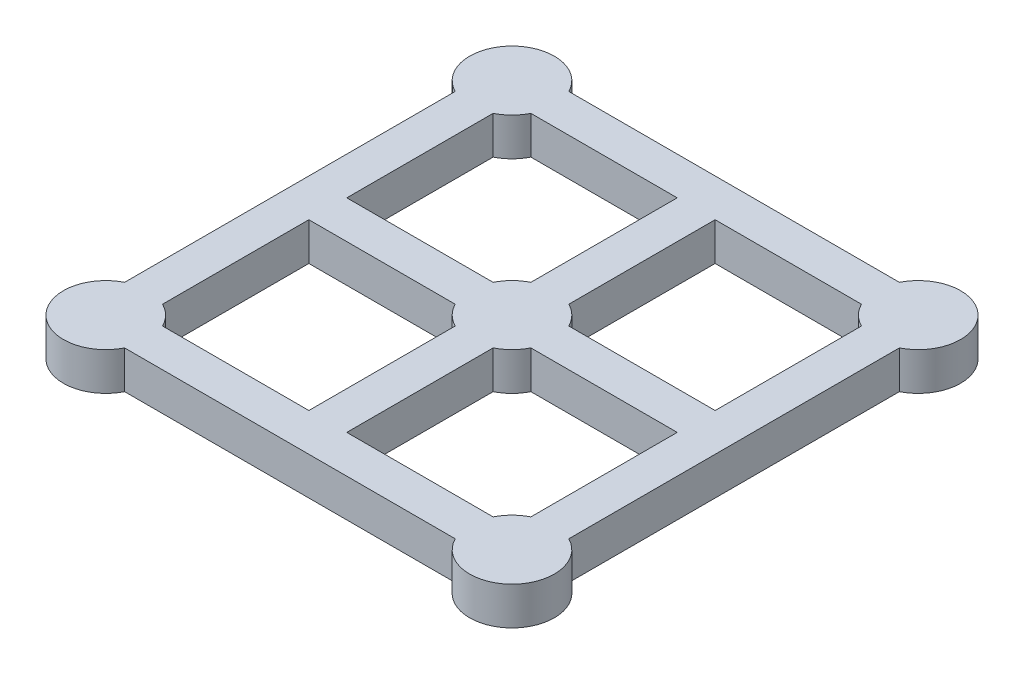
ISO-10303-21;
HEADER;
FILE_DESCRIPTION(('STEP AP214'),'2;1');
FILE_NAME('part.step','',(''),(''),'','','');
FILE_SCHEMA(('AUTOMOTIVE_DESIGN { 1 0 10303 214 1 1 1 1 }'));
ENDSEC;
DATA;
#1=APPLICATION_CONTEXT('core data for automotive mechanical design processes');
#2=APPLICATION_PROTOCOL_DEFINITION('international standard','automotive_design',2000,#1);
#3=PRODUCT_CONTEXT('',#1,'mechanical');
#4=PRODUCT('Part','Part','',(#3));
#5=PRODUCT_RELATED_PRODUCT_CATEGORY('part','',(#4));
#6=PRODUCT_DEFINITION_FORMATION('','',#4);
#7=PRODUCT_DEFINITION_CONTEXT('part definition',#1,'design');
#8=PRODUCT_DEFINITION('design','',#6,#7);
#9=PRODUCT_DEFINITION_SHAPE('','',#8);
#10=(LENGTH_UNIT() NAMED_UNIT(*) SI_UNIT(.MILLI.,.METRE.));
#11=(NAMED_UNIT(*) PLANE_ANGLE_UNIT() SI_UNIT($,.RADIAN.));
#12=(NAMED_UNIT(*) SI_UNIT($,.STERADIAN.) SOLID_ANGLE_UNIT());
#13=UNCERTAINTY_MEASURE_WITH_UNIT(LENGTH_MEASURE(1.E-05),#10,'distance_accuracy_value','');
#14=(GEOMETRIC_REPRESENTATION_CONTEXT(3) GLOBAL_UNCERTAINTY_ASSIGNED_CONTEXT((#13)) GLOBAL_UNIT_ASSIGNED_CONTEXT((#10,
#11,#12)) REPRESENTATION_CONTEXT('',''));
#15=CARTESIAN_POINT('',(0.,0.,0.));
#16=DIRECTION('',(0.,0.,1.));
#17=DIRECTION('',(1.,0.,0.));
#18=AXIS2_PLACEMENT_3D('',#15,#16,#17);
#19=CARTESIAN_POINT('',(19.05,3.556,-19.05));
#20=DIRECTION('',(0.,1.,0.));
#21=DIRECTION('',(0.,0.,1.));
#22=AXIS2_PLACEMENT_3D('',#19,#20,#21);
#23=PLANE('',#22);
#24=CARTESIAN_POINT('',(19.05,3.556,-19.05));
#25=DIRECTION('',(0.,1.,0.));
#26=DIRECTION('',(0.,0.,1.));
#27=AXIS2_PLACEMENT_3D('',#24,#25,#26);
#28=CIRCLE('',#27,3.96875000000007);
#29=CARTESIAN_POINT('',(20.8279999999998,3.556,-15.5018043229698));
#30=VERTEX_POINT('',#29);
#31=CARTESIAN_POINT('',(15.5018043229686,3.556,-20.8280000000004));
#32=VERTEX_POINT('',#31);
#33=EDGE_CURVE('E429',#30,#32,#28,.T.);
#34=ORIENTED_EDGE('',*,*,#33,.T.);
#35=DIRECTION('',(-1.,0.,0.));
#36=VECTOR('',#35,1.);
#37=CARTESIAN_POINT('',(15.5018043229686,3.556,-20.8280000000004));
#38=LINE('',#37,#36);
#39=CARTESIAN_POINT('',(-15.5018043229686,3.556,-20.8280000000004));
#40=VERTEX_POINT('',#39);
#41=EDGE_CURVE('E432',#32,#40,#38,.T.);
#42=ORIENTED_EDGE('',*,*,#41,.T.);
#43=CARTESIAN_POINT('',(-19.0499999999998,3.556,-19.0499999999996));
#44=DIRECTION('',(0.,1.,0.));
#45=DIRECTION('',(0.,0.,1.));
#46=AXIS2_PLACEMENT_3D('',#43,#44,#45);
#47=CIRCLE('',#46,3.96875);
#48=CARTESIAN_POINT('',(-20.8280000000002,3.556,-15.5018043229689));
#49=VERTEX_POINT('',#48);
#50=EDGE_CURVE('E435',#40,#49,#47,.T.);
#51=ORIENTED_EDGE('',*,*,#50,.T.);
#52=DIRECTION('',(0.,0.,1.));
#53=VECTOR('',#52,1.);
#54=CARTESIAN_POINT('',(-20.8279999999998,3.556,-15.5018043229697));
#55=LINE('',#54,#53);
#56=CARTESIAN_POINT('',(-20.8279999999998,3.556,15.5018043229697));
#57=VERTEX_POINT('',#56);
#58=EDGE_CURVE('E437',#49,#57,#55,.T.);
#59=ORIENTED_EDGE('',*,*,#58,.T.);
#60=CARTESIAN_POINT('',(-19.0499999999998,3.556,19.0500000000004));
#61=DIRECTION('',(0.,1.,0.));
#62=DIRECTION('',(0.,0.,1.));
#63=AXIS2_PLACEMENT_3D('',#60,#61,#62);
#64=CIRCLE('',#63,3.96875);
#65=CARTESIAN_POINT('',(-15.501804322969,3.556,20.8280000000004));
#66=VERTEX_POINT('',#65);
#67=EDGE_CURVE('E439',#57,#66,#64,.T.);
#68=ORIENTED_EDGE('',*,*,#67,.T.);
#69=DIRECTION('',(1.,0.,0.));
#70=VECTOR('',#69,1.);
#71=CARTESIAN_POINT('',(15.501804322969,3.556,20.8280000000004));
#72=LINE('',#71,#70);
#73=CARTESIAN_POINT('',(15.501804322969,3.556,20.8280000000004));
#74=VERTEX_POINT('',#73);
#75=EDGE_CURVE('E441',#66,#74,#72,.T.);
#76=ORIENTED_EDGE('',*,*,#75,.T.);
#77=CARTESIAN_POINT('',(19.05,3.556,19.05));
#78=DIRECTION('',(0.,1.,0.));
#79=DIRECTION('',(0.,0.,1.));
#80=AXIS2_PLACEMENT_3D('',#77,#78,#79);
#81=CIRCLE('',#80,3.96874999999985);
#82=CARTESIAN_POINT('',(20.828,3.556,15.5018043229694));
#83=VERTEX_POINT('',#82);
#84=EDGE_CURVE('E443',#74,#83,#81,.T.);
#85=ORIENTED_EDGE('',*,*,#84,.T.);
#86=DIRECTION('',(0.,0.,-1.));
#87=VECTOR('',#86,1.);
#88=CARTESIAN_POINT('',(20.8279999999998,3.556,-15.5018043229698));
#89=LINE('',#88,#87);
#90=EDGE_CURVE('E445',#83,#30,#89,.T.);
#91=ORIENTED_EDGE('',*,*,#90,.T.);
#92=EDGE_LOOP('',(#34,#42,#51,#59,#68,#76,#85,#91));
#93=FACE_BOUND('',#92,.T.);
#94=DIRECTION('',(0.,0.,1.));
#95=VECTOR('',#94,1.);
#96=CARTESIAN_POINT('',(1.778,3.556,-17.2720000000001));
#97=LINE('',#96,#95);
#98=CARTESIAN_POINT('',(1.778,3.556,-17.2720000000001));
#99=VERTEX_POINT('',#98);
#100=CARTESIAN_POINT('',(1.778,3.556,-3.54819567703079));
#101=VERTEX_POINT('',#100);
#102=EDGE_CURVE('E386',#99,#101,#97,.T.);
#103=ORIENTED_EDGE('',*,*,#102,.F.);
#104=DIRECTION('',(-1.,0.,0.));
#105=VECTOR('',#104,1.);
#106=CARTESIAN_POINT('',(1.778,3.556,-17.2720000000001));
#107=LINE('',#106,#105);
#108=CARTESIAN_POINT('',(15.501804322969,3.556,-17.2720000000006));
#109=VERTEX_POINT('',#108);
#110=EDGE_CURVE('E384',#109,#99,#107,.T.);
#111=ORIENTED_EDGE('',*,*,#110,.F.);
#112=CARTESIAN_POINT('',(19.05,3.556,-19.05));
#113=DIRECTION('',(0.,-1.,0.));
#114=DIRECTION('',(0.,0.,1.));
#115=AXIS2_PLACEMENT_3D('',#112,#113,#114);
#116=CIRCLE('',#115,3.96874999999998);
#117=CARTESIAN_POINT('',(17.2719999999996,3.556,-15.5018043229695));
#118=VERTEX_POINT('',#117);
#119=EDGE_CURVE('E396',#118,#109,#116,.T.);
#120=ORIENTED_EDGE('',*,*,#119,.F.);
#121=DIRECTION('',(0.,0.,-1.));
#122=VECTOR('',#121,1.);
#123=CARTESIAN_POINT('',(17.2719999999999,3.556,-1.778));
#124=LINE('',#123,#122);
#125=CARTESIAN_POINT('',(17.2719999999999,3.556,-1.778));
#126=VERTEX_POINT('',#125);
#127=EDGE_CURVE('E393',#126,#118,#124,.T.);
#128=ORIENTED_EDGE('',*,*,#127,.F.);
#129=DIRECTION('',(1.,0.,0.));
#130=VECTOR('',#129,1.);
#131=CARTESIAN_POINT('',(3.54819567703079,3.556,-1.778));
#132=LINE('',#131,#130);
#133=CARTESIAN_POINT('',(3.54819567703079,3.556,-1.778));
#134=VERTEX_POINT('',#133);
#135=EDGE_CURVE('E391',#134,#126,#132,.T.);
#136=ORIENTED_EDGE('',*,*,#135,.F.);
#137=CARTESIAN_POINT('',(0.,3.556,0.));
#138=DIRECTION('',(0.,-1.,0.));
#139=DIRECTION('',(0.,0.,1.));
#140=AXIS2_PLACEMENT_3D('',#137,#138,#139);
#141=CIRCLE('',#140,3.96875);
#142=EDGE_CURVE('E389',#101,#134,#141,.T.);
#143=ORIENTED_EDGE('',*,*,#142,.F.);
#144=EDGE_LOOP('',(#103,#111,#120,#128,#136,#143));
#145=FACE_BOUND('',#144,.T.);
#146=DIRECTION('',(0.,0.,1.));
#147=VECTOR('',#146,1.);
#148=CARTESIAN_POINT('',(-17.272,3.556,-1.778));
#149=LINE('',#148,#147);
#150=CARTESIAN_POINT('',(-17.2719999999998,3.556,-15.5018043229696));
#151=VERTEX_POINT('',#150);
#152=CARTESIAN_POINT('',(-17.272,3.556,-1.778));
#153=VERTEX_POINT('',#152);
#154=EDGE_CURVE('E341',#151,#153,#149,.T.);
#155=ORIENTED_EDGE('',*,*,#154,.F.);
#156=CARTESIAN_POINT('',(-19.0499999999998,3.556,-19.0499999999996));
#157=DIRECTION('',(0.,-1.,0.));
#158=DIRECTION('',(0.,0.,1.));
#159=AXIS2_PLACEMENT_3D('',#156,#157,#158);
#160=CIRCLE('',#159,3.96874999999961);
#161=CARTESIAN_POINT('',(-15.5018043229686,3.556,-17.2720000000004));
#162=VERTEX_POINT('',#161);
#163=EDGE_CURVE('E339',#162,#151,#160,.T.);
#164=ORIENTED_EDGE('',*,*,#163,.F.);
#165=DIRECTION('',(-1.,0.,0.));
#166=VECTOR('',#165,1.);
#167=CARTESIAN_POINT('',(-15.5018043229686,3.556,-17.2720000000004));
#168=LINE('',#167,#166);
#169=CARTESIAN_POINT('',(-1.778,3.556,-17.2720000000001));
#170=VERTEX_POINT('',#169);
#171=EDGE_CURVE('E351',#170,#162,#168,.T.);
#172=ORIENTED_EDGE('',*,*,#171,.F.);
#173=DIRECTION('',(0.,0.,-1.));
#174=VECTOR('',#173,1.);
#175=CARTESIAN_POINT('',(-1.778,3.556,-3.54819567703079));
#176=LINE('',#175,#174);
#177=CARTESIAN_POINT('',(-1.778,3.556,-3.54819567703079));
#178=VERTEX_POINT('',#177);
#179=EDGE_CURVE('E348',#178,#170,#176,.T.);
#180=ORIENTED_EDGE('',*,*,#179,.F.);
#181=CARTESIAN_POINT('',(0.,3.556,0.));
#182=DIRECTION('',(0.,-1.,0.));
#183=DIRECTION('',(0.,0.,1.));
#184=AXIS2_PLACEMENT_3D('',#181,#182,#183);
#185=CIRCLE('',#184,3.96875);
#186=CARTESIAN_POINT('',(-3.54819567703079,3.556,-1.778));
#187=VERTEX_POINT('',#186);
#188=EDGE_CURVE('E346',#187,#178,#185,.T.);
#189=ORIENTED_EDGE('',*,*,#188,.F.);
#190=DIRECTION('',(1.,0.,0.));
#191=VECTOR('',#190,1.);
#192=CARTESIAN_POINT('',(-17.272,3.556,-1.778));
#193=LINE('',#192,#191);
#194=EDGE_CURVE('E344',#153,#187,#193,.T.);
#195=ORIENTED_EDGE('',*,*,#194,.F.);
#196=EDGE_LOOP('',(#155,#164,#172,#180,#189,#195));
#197=FACE_BOUND('',#196,.T.);
#198=DIRECTION('',(1.,0.,0.));
#199=VECTOR('',#198,1.);
#200=CARTESIAN_POINT('',(-15.501804322969,3.556,17.2720000000004));
#201=LINE('',#200,#199);
#202=CARTESIAN_POINT('',(-15.501804322969,3.556,17.2720000000004));
#203=VERTEX_POINT('',#202);
#204=CARTESIAN_POINT('',(-1.778,3.556,17.2720000000004));
#205=VERTEX_POINT('',#204);
#206=EDGE_CURVE('E296',#203,#205,#201,.T.);
#207=ORIENTED_EDGE('',*,*,#206,.F.);
#208=CARTESIAN_POINT('',(-19.0499999999998,3.556,19.0500000000004));
#209=DIRECTION('',(0.,-1.,0.));
#210=DIRECTION('',(0.,0.,1.));
#211=AXIS2_PLACEMENT_3D('',#208,#209,#210);
#212=CIRCLE('',#211,3.96875);
#213=CARTESIAN_POINT('',(-17.2719999999998,3.556,15.5018043229697));
#214=VERTEX_POINT('',#213);
#215=EDGE_CURVE('E294',#214,#203,#212,.T.);
#216=ORIENTED_EDGE('',*,*,#215,.F.);
#217=DIRECTION('',(0.,0.,1.));
#218=VECTOR('',#217,1.);
#219=CARTESIAN_POINT('',(-17.2719999999998,3.556,15.5018043229697));
#220=LINE('',#219,#218);
#221=CARTESIAN_POINT('',(-17.272,3.556,1.77800000000001));
#222=VERTEX_POINT('',#221);
#223=EDGE_CURVE('E306',#222,#214,#220,.T.);
#224=ORIENTED_EDGE('',*,*,#223,.F.);
#225=DIRECTION('',(-1.,0.,0.));
#226=VECTOR('',#225,1.);
#227=CARTESIAN_POINT('',(-3.54819567703079,3.556,1.778));
#228=LINE('',#227,#226);
#229=CARTESIAN_POINT('',(-3.54819567703079,3.556,1.778));
#230=VERTEX_POINT('',#229);
#231=EDGE_CURVE('E303',#230,#222,#228,.T.);
#232=ORIENTED_EDGE('',*,*,#231,.F.);
#233=CARTESIAN_POINT('',(0.,3.556,0.));
#234=DIRECTION('',(0.,-1.,0.));
#235=DIRECTION('',(0.,0.,1.));
#236=AXIS2_PLACEMENT_3D('',#233,#234,#235);
#237=CIRCLE('',#236,3.96875);
#238=CARTESIAN_POINT('',(-1.778,3.556,3.54819567703079));
#239=VERTEX_POINT('',#238);
#240=EDGE_CURVE('E301',#239,#230,#237,.T.);
#241=ORIENTED_EDGE('',*,*,#240,.F.);
#242=DIRECTION('',(0.,0.,-1.));
#243=VECTOR('',#242,1.);
#244=CARTESIAN_POINT('',(-1.778,3.556,17.2720000000004));
#245=LINE('',#244,#243);
#246=EDGE_CURVE('E299',#205,#239,#245,.T.);
#247=ORIENTED_EDGE('',*,*,#246,.F.);
#248=EDGE_LOOP('',(#207,#216,#224,#232,#241,#247));
#249=FACE_BOUND('',#248,.T.);
#250=DIRECTION('',(0.,0.,-1.));
#251=VECTOR('',#250,1.);
#252=CARTESIAN_POINT('',(17.2719999999998,3.556,15.5018043229698));
#253=LINE('',#252,#251);
#254=CARTESIAN_POINT('',(17.2719999999998,3.556,15.5018043229698));
#255=VERTEX_POINT('',#254);
#256=CARTESIAN_POINT('',(17.2719999999999,3.556,1.77799999999999));
#257=VERTEX_POINT('',#256);
#258=EDGE_CURVE('E251',#255,#257,#253,.T.);
#259=ORIENTED_EDGE('',*,*,#258,.F.);
#260=CARTESIAN_POINT('',(19.05,3.556,19.05));
#261=DIRECTION('',(0.,-1.,0.));
#262=DIRECTION('',(0.,0.,1.));
#263=AXIS2_PLACEMENT_3D('',#260,#261,#262);
#264=CIRCLE('',#263,3.96874999999972);
#265=CARTESIAN_POINT('',(15.501804322969,3.556,17.2720000000004));
#266=VERTEX_POINT('',#265);
#267=EDGE_CURVE('E243',#266,#255,#264,.T.);
#268=ORIENTED_EDGE('',*,*,#267,.F.);
#269=DIRECTION('',(1.,0.,0.));
#270=VECTOR('',#269,1.);
#271=CARTESIAN_POINT('',(1.778,3.556,17.2720000000004));
#272=LINE('',#271,#270);
#273=CARTESIAN_POINT('',(1.77800000000001,3.556,17.2720000000004));
#274=VERTEX_POINT('',#273);
#275=EDGE_CURVE('E272',#274,#266,#272,.T.);
#276=ORIENTED_EDGE('',*,*,#275,.F.);
#277=DIRECTION('',(0.,0.,1.));
#278=VECTOR('',#277,1.);
#279=CARTESIAN_POINT('',(1.778,3.556,3.54819567703079));
#280=LINE('',#279,#278);
#281=CARTESIAN_POINT('',(1.778,3.556,3.54819567703079));
#282=VERTEX_POINT('',#281);
#283=EDGE_CURVE('E270',#282,#274,#280,.T.);
#284=ORIENTED_EDGE('',*,*,#283,.F.);
#285=CARTESIAN_POINT('',(0.,3.556,0.));
#286=DIRECTION('',(0.,-1.,0.));
#287=DIRECTION('',(0.,0.,1.));
#288=AXIS2_PLACEMENT_3D('',#285,#286,#287);
#289=CIRCLE('',#288,3.96875);
#290=CARTESIAN_POINT('',(3.54819567703079,3.556,1.778));
#291=VERTEX_POINT('',#290);
#292=EDGE_CURVE('E266',#291,#282,#289,.T.);
#293=ORIENTED_EDGE('',*,*,#292,.F.);
#294=DIRECTION('',(-1.,0.,0.));
#295=VECTOR('',#294,1.);
#296=CARTESIAN_POINT('',(17.2719999999999,3.556,1.77799999999999));
#297=LINE('',#296,#295);
#298=EDGE_CURVE('E264',#257,#291,#297,.T.);
#299=ORIENTED_EDGE('',*,*,#298,.F.);
#300=EDGE_LOOP('',(#259,#268,#276,#284,#293,#299));
#301=FACE_BOUND('',#300,.T.);
#302=ADVANCED_FACE('F34',(#93,#145,#197,#249,#301),#23,.T.);
#303=CARTESIAN_POINT('',(19.05,0.,-19.05));
#304=DIRECTION('',(0.,1.,0.));
#305=DIRECTION('',(0.,0.,1.));
#306=AXIS2_PLACEMENT_3D('',#303,#304,#305);
#307=PLANE('',#306);
#308=CARTESIAN_POINT('',(-19.0499999999998,0.,19.0500000000004));
#309=DIRECTION('',(0.,-1.,0.));
#310=DIRECTION('',(0.,0.,1.));
#311=AXIS2_PLACEMENT_3D('',#308,#309,#310);
#312=CIRCLE('',#311,3.96875);
#313=CARTESIAN_POINT('',(-17.2719999999998,0.,15.5018043229697));
#314=VERTEX_POINT('',#313);
#315=CARTESIAN_POINT('',(-15.501804322969,0.,17.2720000000004));
#316=VERTEX_POINT('',#315);
#317=EDGE_CURVE('E259',#314,#316,#312,.T.);
#318=ORIENTED_EDGE('',*,*,#317,.T.);
#319=DIRECTION('',(1.,0.,0.));
#320=VECTOR('',#319,1.);
#321=CARTESIAN_POINT('',(-15.501804322969,0.,17.2720000000004));
#322=LINE('',#321,#320);
#323=CARTESIAN_POINT('',(-1.778,0.,17.2720000000004));
#324=VERTEX_POINT('',#323);
#325=EDGE_CURVE('E311',#316,#324,#322,.T.);
#326=ORIENTED_EDGE('',*,*,#325,.T.);
#327=DIRECTION('',(0.,0.,-1.));
#328=VECTOR('',#327,1.);
#329=CARTESIAN_POINT('',(-1.778,0.,17.2720000000004));
#330=LINE('',#329,#328);
#331=CARTESIAN_POINT('',(-1.778,0.,3.54819567703079));
#332=VERTEX_POINT('',#331);
#333=EDGE_CURVE('E314',#324,#332,#330,.T.);
#334=ORIENTED_EDGE('',*,*,#333,.T.);
#335=CARTESIAN_POINT('',(0.,0.,0.));
#336=DIRECTION('',(0.,-1.,0.));
#337=DIRECTION('',(0.,0.,1.));
#338=AXIS2_PLACEMENT_3D('',#335,#336,#337);
#339=CIRCLE('',#338,3.96875);
#340=CARTESIAN_POINT('',(-3.54819567703079,0.,1.778));
#341=VERTEX_POINT('',#340);
#342=EDGE_CURVE('E317',#332,#341,#339,.T.);
#343=ORIENTED_EDGE('',*,*,#342,.T.);
#344=DIRECTION('',(-1.,0.,0.));
#345=VECTOR('',#344,1.);
#346=CARTESIAN_POINT('',(-3.54819567703079,0.,1.778));
#347=LINE('',#346,#345);
#348=CARTESIAN_POINT('',(-17.272,0.,1.778));
#349=VERTEX_POINT('',#348);
#350=EDGE_CURVE('E320',#341,#349,#347,.T.);
#351=ORIENTED_EDGE('',*,*,#350,.T.);
#352=DIRECTION('',(0.,0.,1.));
#353=VECTOR('',#352,1.);
#354=CARTESIAN_POINT('',(-17.2719999999998,0.,15.5018043229697));
#355=LINE('',#354,#353);
#356=EDGE_CURVE('E297',#349,#314,#355,.T.);
#357=ORIENTED_EDGE('',*,*,#356,.T.);
#358=EDGE_LOOP('',(#318,#326,#334,#343,#351,#357));
#359=FACE_BOUND('',#358,.T.);
#360=DIRECTION('',(-1.,0.,0.));
#361=VECTOR('',#360,1.);
#362=CARTESIAN_POINT('',(1.778,0.,-17.2720000000001));
#363=LINE('',#362,#361);
#364=CARTESIAN_POINT('',(15.501804322969,0.,-17.2720000000006));
#365=VERTEX_POINT('',#364);
#366=CARTESIAN_POINT('',(1.778,0.,-17.2720000000001));
#367=VERTEX_POINT('',#366);
#368=EDGE_CURVE('E383',#365,#367,#363,.T.);
#369=ORIENTED_EDGE('',*,*,#368,.T.);
#370=DIRECTION('',(0.,0.,1.));
#371=VECTOR('',#370,1.);
#372=CARTESIAN_POINT('',(1.778,0.,-17.2720000000001));
#373=LINE('',#372,#371);
#374=CARTESIAN_POINT('',(1.778,0.,-3.54819567703079));
#375=VERTEX_POINT('',#374);
#376=EDGE_CURVE('E401',#367,#375,#373,.T.);
#377=ORIENTED_EDGE('',*,*,#376,.T.);
#378=CARTESIAN_POINT('',(0.,0.,0.));
#379=DIRECTION('',(0.,-1.,0.));
#380=DIRECTION('',(0.,0.,1.));
#381=AXIS2_PLACEMENT_3D('',#378,#379,#380);
#382=CIRCLE('',#381,3.96875);
#383=CARTESIAN_POINT('',(3.54819567703079,0.,-1.778));
#384=VERTEX_POINT('',#383);
#385=EDGE_CURVE('E404',#375,#384,#382,.T.);
#386=ORIENTED_EDGE('',*,*,#385,.T.);
#387=DIRECTION('',(1.,0.,0.));
#388=VECTOR('',#387,1.);
#389=CARTESIAN_POINT('',(3.54819567703079,0.,-1.778));
#390=LINE('',#389,#388);
#391=CARTESIAN_POINT('',(17.2719999999999,0.,-1.778));
#392=VERTEX_POINT('',#391);
#393=EDGE_CURVE('E407',#384,#392,#390,.T.);
#394=ORIENTED_EDGE('',*,*,#393,.T.);
#395=DIRECTION('',(0.,0.,-1.));
#396=VECTOR('',#395,1.);
#397=CARTESIAN_POINT('',(17.2719999999999,0.,-1.778));
#398=LINE('',#397,#396);
#399=CARTESIAN_POINT('',(17.2719999999998,0.,-15.5018043229698));
#400=VERTEX_POINT('',#399);
#401=EDGE_CURVE('E410',#392,#400,#398,.T.);
#402=ORIENTED_EDGE('',*,*,#401,.T.);
#403=CARTESIAN_POINT('',(19.05,0.,-19.05));
#404=DIRECTION('',(0.,-1.,0.));
#405=DIRECTION('',(0.,0.,1.));
#406=AXIS2_PLACEMENT_3D('',#403,#404,#405);
#407=CIRCLE('',#406,3.96874999999998);
#408=EDGE_CURVE('E387',#400,#365,#407,.T.);
#409=ORIENTED_EDGE('',*,*,#408,.T.);
#410=EDGE_LOOP('',(#369,#377,#386,#394,#402,#409));
#411=FACE_BOUND('',#410,.T.);
#412=CARTESIAN_POINT('',(19.05,0.,-19.05));
#413=DIRECTION('',(0.,1.,0.));
#414=DIRECTION('',(0.,0.,1.));
#415=AXIS2_PLACEMENT_3D('',#412,#413,#414);
#416=CIRCLE('',#415,3.96875000000007);
#417=CARTESIAN_POINT('',(20.8279999999998,0.,-15.5018043229698));
#418=VERTEX_POINT('',#417);
#419=CARTESIAN_POINT('',(15.5018043229686,0.,-20.8280000000004));
#420=VERTEX_POINT('',#419);
#421=EDGE_CURVE('E428',#418,#420,#416,.T.);
#422=ORIENTED_EDGE('',*,*,#421,.F.);
#423=DIRECTION('',(0.,0.,-1.));
#424=VECTOR('',#423,1.);
#425=CARTESIAN_POINT('',(20.8279999999998,0.,-15.5018043229698));
#426=LINE('',#425,#424);
#427=CARTESIAN_POINT('',(20.828,0.,15.5018043229694));
#428=VERTEX_POINT('',#427);
#429=EDGE_CURVE('E433',#428,#418,#426,.T.);
#430=ORIENTED_EDGE('',*,*,#429,.F.);
#431=CARTESIAN_POINT('',(19.05,0.,19.05));
#432=DIRECTION('',(0.,1.,0.));
#433=DIRECTION('',(0.,0.,1.));
#434=AXIS2_PLACEMENT_3D('',#431,#432,#433);
#435=CIRCLE('',#434,3.96874999999985);
#436=CARTESIAN_POINT('',(15.501804322969,0.,20.8280000000004));
#437=VERTEX_POINT('',#436);
#438=EDGE_CURVE('E460',#437,#428,#435,.T.);
#439=ORIENTED_EDGE('',*,*,#438,.F.);
#440=DIRECTION('',(1.,0.,0.));
#441=VECTOR('',#440,1.);
#442=CARTESIAN_POINT('',(15.501804322969,0.,20.8280000000004));
#443=LINE('',#442,#441);
#444=CARTESIAN_POINT('',(-15.501804322969,0.,20.8280000000004));
#445=VERTEX_POINT('',#444);
#446=EDGE_CURVE('E458',#445,#437,#443,.T.);
#447=ORIENTED_EDGE('',*,*,#446,.F.);
#448=CARTESIAN_POINT('',(-19.0499999999998,0.,19.0500000000004));
#449=DIRECTION('',(0.,1.,0.));
#450=DIRECTION('',(0.,0.,1.));
#451=AXIS2_PLACEMENT_3D('',#448,#449,#450);
#452=CIRCLE('',#451,3.96875);
#453=CARTESIAN_POINT('',(-20.8279999999998,0.,15.5018043229697));
#454=VERTEX_POINT('',#453);
#455=EDGE_CURVE('E456',#454,#445,#452,.T.);
#456=ORIENTED_EDGE('',*,*,#455,.F.);
#457=DIRECTION('',(0.,0.,1.));
#458=VECTOR('',#457,1.);
#459=CARTESIAN_POINT('',(-20.8279999999998,0.,-15.5018043229697));
#460=LINE('',#459,#458);
#461=CARTESIAN_POINT('',(-20.8280000000002,0.,-15.5018043229689));
#462=VERTEX_POINT('',#461);
#463=EDGE_CURVE('E454',#462,#454,#460,.T.);
#464=ORIENTED_EDGE('',*,*,#463,.F.);
#465=CARTESIAN_POINT('',(-19.0499999999998,0.,-19.0499999999996));
#466=DIRECTION('',(0.,1.,0.));
#467=DIRECTION('',(0.,0.,1.));
#468=AXIS2_PLACEMENT_3D('',#465,#466,#467);
#469=CIRCLE('',#468,3.96875);
#470=CARTESIAN_POINT('',(-15.5018043229686,0.,-20.8280000000004));
#471=VERTEX_POINT('',#470);
#472=EDGE_CURVE('E452',#471,#462,#469,.T.);
#473=ORIENTED_EDGE('',*,*,#472,.F.);
#474=DIRECTION('',(-1.,0.,0.));
#475=VECTOR('',#474,1.);
#476=CARTESIAN_POINT('',(15.5018043229686,0.,-20.8280000000004));
#477=LINE('',#476,#475);
#478=EDGE_CURVE('E450',#420,#471,#477,.T.);
#479=ORIENTED_EDGE('',*,*,#478,.F.);
#480=EDGE_LOOP('',(#422,#430,#439,#447,#456,#464,#473,#479));
#481=FACE_BOUND('',#480,.T.);
#482=CARTESIAN_POINT('',(-19.0499999999998,0.,-19.0499999999996));
#483=DIRECTION('',(0.,-1.,0.));
#484=DIRECTION('',(0.,0.,1.));
#485=AXIS2_PLACEMENT_3D('',#482,#483,#484);
#486=CIRCLE('',#485,3.96874999999961);
#487=CARTESIAN_POINT('',(-15.5018043229686,0.,-17.2720000000004));
#488=VERTEX_POINT('',#487);
#489=CARTESIAN_POINT('',(-17.2719999999998,0.,-15.5018043229696));
#490=VERTEX_POINT('',#489);
#491=EDGE_CURVE('E338',#488,#490,#486,.T.);
#492=ORIENTED_EDGE('',*,*,#491,.T.);
#493=DIRECTION('',(0.,0.,1.));
#494=VECTOR('',#493,1.);
#495=CARTESIAN_POINT('',(-17.272,0.,-1.778));
#496=LINE('',#495,#494);
#497=CARTESIAN_POINT('',(-17.272,0.,-1.778));
#498=VERTEX_POINT('',#497);
#499=EDGE_CURVE('E356',#490,#498,#496,.T.);
#500=ORIENTED_EDGE('',*,*,#499,.T.);
#501=DIRECTION('',(1.,0.,0.));
#502=VECTOR('',#501,1.);
#503=CARTESIAN_POINT('',(-17.272,0.,-1.778));
#504=LINE('',#503,#502);
#505=CARTESIAN_POINT('',(-3.54819567703079,0.,-1.778));
#506=VERTEX_POINT('',#505);
#507=EDGE_CURVE('E359',#498,#506,#504,.T.);
#508=ORIENTED_EDGE('',*,*,#507,.T.);
#509=CARTESIAN_POINT('',(0.,0.,0.));
#510=DIRECTION('',(0.,-1.,0.));
#511=DIRECTION('',(0.,0.,1.));
#512=AXIS2_PLACEMENT_3D('',#509,#510,#511);
#513=CIRCLE('',#512,3.96875);
#514=CARTESIAN_POINT('',(-1.778,0.,-3.54819567703079));
#515=VERTEX_POINT('',#514);
#516=EDGE_CURVE('E362',#506,#515,#513,.T.);
#517=ORIENTED_EDGE('',*,*,#516,.T.);
#518=DIRECTION('',(0.,0.,-1.));
#519=VECTOR('',#518,1.);
#520=CARTESIAN_POINT('',(-1.778,0.,-3.54819567703079));
#521=LINE('',#520,#519);
#522=CARTESIAN_POINT('',(-1.778,0.,-17.2720000000001));
#523=VERTEX_POINT('',#522);
#524=EDGE_CURVE('E365',#515,#523,#521,.T.);
#525=ORIENTED_EDGE('',*,*,#524,.T.);
#526=DIRECTION('',(-1.,0.,0.));
#527=VECTOR('',#526,1.);
#528=CARTESIAN_POINT('',(-15.5018043229686,0.,-17.2720000000004));
#529=LINE('',#528,#527);
#530=EDGE_CURVE('E342',#523,#488,#529,.T.);
#531=ORIENTED_EDGE('',*,*,#530,.T.);
#532=EDGE_LOOP('',(#492,#500,#508,#517,#525,#531));
#533=FACE_BOUND('',#532,.T.);
#534=CARTESIAN_POINT('',(19.05,0.,19.05));
#535=DIRECTION('',(0.,-1.,0.));
#536=DIRECTION('',(0.,0.,1.));
#537=AXIS2_PLACEMENT_3D('',#534,#535,#536);
#538=CIRCLE('',#537,3.96874999999972);
#539=CARTESIAN_POINT('',(15.501804322969,0.,17.2720000000004));
#540=VERTEX_POINT('',#539);
#541=CARTESIAN_POINT('',(17.2719999999998,0.,15.5018043229698));
#542=VERTEX_POINT('',#541);
#543=EDGE_CURVE('E57',#540,#542,#538,.T.);
#544=ORIENTED_EDGE('',*,*,#543,.T.);
#545=DIRECTION('',(0.,0.,-1.));
#546=VECTOR('',#545,1.);
#547=CARTESIAN_POINT('',(17.2719999999998,0.,15.5018043229698));
#548=LINE('',#547,#546);
#549=CARTESIAN_POINT('',(17.2719999999999,0.,1.77799999999999));
#550=VERTEX_POINT('',#549);
#551=EDGE_CURVE('E258',#542,#550,#548,.T.);
#552=ORIENTED_EDGE('',*,*,#551,.T.);
#553=DIRECTION('',(-1.,0.,0.));
#554=VECTOR('',#553,1.);
#555=CARTESIAN_POINT('',(17.2719999999999,0.,1.77799999999999));
#556=LINE('',#555,#554);
#557=CARTESIAN_POINT('',(3.54819567703079,0.,1.778));
#558=VERTEX_POINT('',#557);
#559=EDGE_CURVE('E276',#550,#558,#556,.T.);
#560=ORIENTED_EDGE('',*,*,#559,.T.);
#561=CARTESIAN_POINT('',(0.,0.,0.));
#562=DIRECTION('',(0.,-1.,0.));
#563=DIRECTION('',(0.,0.,1.));
#564=AXIS2_PLACEMENT_3D('',#561,#562,#563);
#565=CIRCLE('',#564,3.96875);
#566=CARTESIAN_POINT('',(1.778,0.,3.54819567703079));
#567=VERTEX_POINT('',#566);
#568=EDGE_CURVE('E279',#558,#567,#565,.T.);
#569=ORIENTED_EDGE('',*,*,#568,.T.);
#570=DIRECTION('',(0.,0.,1.));
#571=VECTOR('',#570,1.);
#572=CARTESIAN_POINT('',(1.778,0.,3.54819567703079));
#573=LINE('',#572,#571);
#574=CARTESIAN_POINT('',(1.778,0.,17.2720000000004));
#575=VERTEX_POINT('',#574);
#576=EDGE_CURVE('E282',#567,#575,#573,.T.);
#577=ORIENTED_EDGE('',*,*,#576,.T.);
#578=DIRECTION('',(1.,0.,0.));
#579=VECTOR('',#578,1.);
#580=CARTESIAN_POINT('',(1.778,0.,17.2720000000004));
#581=LINE('',#580,#579);
#582=EDGE_CURVE('E252',#575,#540,#581,.T.);
#583=ORIENTED_EDGE('',*,*,#582,.T.);
#584=EDGE_LOOP('',(#544,#552,#560,#569,#577,#583));
#585=FACE_BOUND('',#584,.T.);
#586=ADVANCED_FACE('F490',(#359,#411,#481,#533,#585),#307,.F.);
#587=CARTESIAN_POINT('',(19.05,3.556,-19.05));
#588=DIRECTION('',(0.,-1.,0.));
#589=DIRECTION('',(0.,0.,-1.));
#590=AXIS2_PLACEMENT_3D('',#587,#588,#589);
#591=CYLINDRICAL_SURFACE('',#590,3.96875000000007);
#592=ORIENTED_EDGE('',*,*,#421,.T.);
#593=DIRECTION('',(0.,-1.,0.));
#594=VECTOR('',#593,1.);
#595=CARTESIAN_POINT('',(15.5018043229686,3.556,-20.8280000000004));
#596=LINE('',#595,#594);
#597=EDGE_CURVE('E11',#32,#420,#596,.T.);
#598=ORIENTED_EDGE('',*,*,#597,.F.);
#599=ORIENTED_EDGE('',*,*,#33,.F.);
#600=DIRECTION('',(0.,-1.,0.));
#601=VECTOR('',#600,1.);
#602=CARTESIAN_POINT('',(20.8279999999998,3.556,-15.5018043229698));
#603=LINE('',#602,#601);
#604=EDGE_CURVE('E447',#30,#418,#603,.T.);
#605=ORIENTED_EDGE('',*,*,#604,.T.);
#606=EDGE_LOOP('',(#592,#598,#599,#605));
#607=FACE_BOUND('',#606,.T.);
#608=ADVANCED_FACE('F36',(#607),#591,.T.);
#609=CARTESIAN_POINT('',(15.5018043229686,3.556,-20.8280000000004));
#610=DIRECTION('',(0.,0.,1.));
#611=DIRECTION('',(1.,0.,0.));
#612=AXIS2_PLACEMENT_3D('',#609,#610,#611);
#613=PLANE('',#612);
#614=ORIENTED_EDGE('',*,*,#478,.T.);
#615=DIRECTION('',(0.,-1.,0.));
#616=VECTOR('',#615,1.);
#617=CARTESIAN_POINT('',(-15.5018043229686,3.556,-20.8280000000004));
#618=LINE('',#617,#616);
#619=EDGE_CURVE('E42',#40,#471,#618,.T.);
#620=ORIENTED_EDGE('',*,*,#619,.F.);
#621=ORIENTED_EDGE('',*,*,#41,.F.);
#622=ORIENTED_EDGE('',*,*,#597,.T.);
#623=EDGE_LOOP('',(#614,#620,#621,#622));
#624=FACE_BOUND('',#623,.T.);
#625=ADVANCED_FACE('F508',(#624),#613,.F.);
#626=CARTESIAN_POINT('',(-19.0499999999998,3.556,-19.0499999999996));
#627=DIRECTION('',(0.,-1.,0.));
#628=DIRECTION('',(0.,0.,-1.));
#629=AXIS2_PLACEMENT_3D('',#626,#627,#628);
#630=CYLINDRICAL_SURFACE('',#629,3.96875);
#631=ORIENTED_EDGE('',*,*,#472,.T.);
#632=DIRECTION('',(0.,-1.,0.));
#633=VECTOR('',#632,1.);
#634=CARTESIAN_POINT('',(-20.8280000000002,3.556,-15.5018043229689));
#635=LINE('',#634,#633);
#636=EDGE_CURVE('E477',#49,#462,#635,.T.);
#637=ORIENTED_EDGE('',*,*,#636,.F.);
#638=ORIENTED_EDGE('',*,*,#50,.F.);
#639=ORIENTED_EDGE('',*,*,#619,.T.);
#640=EDGE_LOOP('',(#631,#637,#638,#639));
#641=FACE_BOUND('',#640,.T.);
#642=ADVANCED_FACE('F484',(#641),#630,.T.);
#643=CARTESIAN_POINT('',(-20.8279999999998,3.556,-15.5018043229697));
#644=DIRECTION('',(1.,0.,0.));
#645=DIRECTION('',(0.,0.,-1.));
#646=AXIS2_PLACEMENT_3D('',#643,#644,#645);
#647=PLANE('',#646);
#648=ORIENTED_EDGE('',*,*,#463,.T.);
#649=DIRECTION('',(0.,-1.,0.));
#650=VECTOR('',#649,1.);
#651=CARTESIAN_POINT('',(-20.8279999999998,3.556,15.5018043229697));
#652=LINE('',#651,#650);
#653=EDGE_CURVE('E474',#57,#454,#652,.T.);
#654=ORIENTED_EDGE('',*,*,#653,.F.);
#655=ORIENTED_EDGE('',*,*,#58,.F.);
#656=ORIENTED_EDGE('',*,*,#636,.T.);
#657=EDGE_LOOP('',(#648,#654,#655,#656));
#658=FACE_BOUND('',#657,.T.);
#659=ADVANCED_FACE('F496',(#658),#647,.F.);
#660=CARTESIAN_POINT('',(-19.0499999999998,3.556,19.0500000000004));
#661=DIRECTION('',(0.,-1.,0.));
#662=DIRECTION('',(0.,0.,-1.));
#663=AXIS2_PLACEMENT_3D('',#660,#661,#662);
#664=CYLINDRICAL_SURFACE('',#663,3.96875);
#665=ORIENTED_EDGE('',*,*,#455,.T.);
#666=DIRECTION('',(0.,-1.,0.));
#667=VECTOR('',#666,1.);
#668=CARTESIAN_POINT('',(-15.501804322969,3.556,20.8280000000004));
#669=LINE('',#668,#667);
#670=EDGE_CURVE('E471',#66,#445,#669,.T.);
#671=ORIENTED_EDGE('',*,*,#670,.F.);
#672=ORIENTED_EDGE('',*,*,#67,.F.);
#673=ORIENTED_EDGE('',*,*,#653,.T.);
#674=EDGE_LOOP('',(#665,#671,#672,#673));
#675=FACE_BOUND('',#674,.T.);
#676=ADVANCED_FACE('F500',(#675),#664,.T.);
#677=CARTESIAN_POINT('',(15.501804322969,3.556,20.8280000000004));
#678=DIRECTION('',(0.,0.,-1.));
#679=DIRECTION('',(-1.,0.,0.));
#680=AXIS2_PLACEMENT_3D('',#677,#678,#679);
#681=PLANE('',#680);
#682=ORIENTED_EDGE('',*,*,#446,.T.);
#683=DIRECTION('',(0.,-1.,0.));
#684=VECTOR('',#683,1.);
#685=CARTESIAN_POINT('',(15.501804322969,3.556,20.8280000000004));
#686=LINE('',#685,#684);
#687=EDGE_CURVE('E468',#74,#437,#686,.T.);
#688=ORIENTED_EDGE('',*,*,#687,.F.);
#689=ORIENTED_EDGE('',*,*,#75,.F.);
#690=ORIENTED_EDGE('',*,*,#670,.T.);
#691=EDGE_LOOP('',(#682,#688,#689,#690));
#692=FACE_BOUND('',#691,.T.);
#693=ADVANCED_FACE('F521',(#692),#681,.F.);
#694=CARTESIAN_POINT('',(19.05,3.556,19.05));
#695=DIRECTION('',(0.,-1.,0.));
#696=DIRECTION('',(0.,0.,-1.));
#697=AXIS2_PLACEMENT_3D('',#694,#695,#696);
#698=CYLINDRICAL_SURFACE('',#697,3.96874999999985);
#699=ORIENTED_EDGE('',*,*,#438,.T.);
#700=DIRECTION('',(0.,-1.,0.));
#701=VECTOR('',#700,1.);
#702=CARTESIAN_POINT('',(20.828,3.556,15.5018043229694));
#703=LINE('',#702,#701);
#704=EDGE_CURVE('E465',#83,#428,#703,.T.);
#705=ORIENTED_EDGE('',*,*,#704,.F.);
#706=ORIENTED_EDGE('',*,*,#84,.F.);
#707=ORIENTED_EDGE('',*,*,#687,.T.);
#708=EDGE_LOOP('',(#699,#705,#706,#707));
#709=FACE_BOUND('',#708,.T.);
#710=ADVANCED_FACE('F519',(#709),#698,.T.);
#711=CARTESIAN_POINT('',(20.8279999999998,3.556,-15.5018043229698));
#712=DIRECTION('',(-1.,0.,0.));
#713=DIRECTION('',(0.,0.,1.));
#714=AXIS2_PLACEMENT_3D('',#711,#712,#713);
#715=PLANE('',#714);
#716=ORIENTED_EDGE('',*,*,#429,.T.);
#717=ORIENTED_EDGE('',*,*,#604,.F.);
#718=ORIENTED_EDGE('',*,*,#90,.F.);
#719=ORIENTED_EDGE('',*,*,#704,.T.);
#720=EDGE_LOOP('',(#716,#717,#718,#719));
#721=FACE_BOUND('',#720,.T.);
#722=ADVANCED_FACE('F514',(#721),#715,.F.);
#723=CARTESIAN_POINT('',(1.778,3.556,-17.2720000000001));
#724=DIRECTION('',(0.,0.,1.));
#725=DIRECTION('',(1.,0.,0.));
#726=AXIS2_PLACEMENT_3D('',#723,#724,#725);
#727=PLANE('',#726);
#728=ORIENTED_EDGE('',*,*,#368,.F.);
#729=DIRECTION('',(0.,-1.,0.));
#730=VECTOR('',#729,1.);
#731=CARTESIAN_POINT('',(15.501804322969,3.556,-17.2720000000006));
#732=LINE('',#731,#730);
#733=EDGE_CURVE('E398',#109,#365,#732,.T.);
#734=ORIENTED_EDGE('',*,*,#733,.F.);
#735=ORIENTED_EDGE('',*,*,#110,.T.);
#736=DIRECTION('',(0.,-1.,0.));
#737=VECTOR('',#736,1.);
#738=CARTESIAN_POINT('',(1.778,3.556,-17.2720000000001));
#739=LINE('',#738,#737);
#740=EDGE_CURVE('E425',#99,#367,#739,.T.);
#741=ORIENTED_EDGE('',*,*,#740,.T.);
#742=EDGE_LOOP('',(#728,#734,#735,#741));
#743=FACE_BOUND('',#742,.T.);
#744=ADVANCED_FACE('F538',(#743),#727,.T.);
#745=CARTESIAN_POINT('',(1.778,3.556,-17.2720000000001));
#746=DIRECTION('',(1.,0.,0.));
#747=DIRECTION('',(0.,0.,-1.));
#748=AXIS2_PLACEMENT_3D('',#745,#746,#747);
#749=PLANE('',#748);
#750=ORIENTED_EDGE('',*,*,#376,.F.);
#751=ORIENTED_EDGE('',*,*,#740,.F.);
#752=ORIENTED_EDGE('',*,*,#102,.T.);
#753=DIRECTION('',(0.,-1.,0.));
#754=VECTOR('',#753,1.);
#755=CARTESIAN_POINT('',(1.778,3.556,-3.54819567703079));
#756=LINE('',#755,#754);
#757=EDGE_CURVE('E423',#101,#375,#756,.T.);
#758=ORIENTED_EDGE('',*,*,#757,.T.);
#759=EDGE_LOOP('',(#750,#751,#752,#758));
#760=FACE_BOUND('',#759,.T.);
#761=ADVANCED_FACE('F545',(#760),#749,.T.);
#762=CARTESIAN_POINT('',(0.,3.556,0.));
#763=DIRECTION('',(0.,-1.,0.));
#764=DIRECTION('',(0.,0.,-1.));
#765=AXIS2_PLACEMENT_3D('',#762,#763,#764);
#766=CYLINDRICAL_SURFACE('',#765,3.96875);
#767=ORIENTED_EDGE('',*,*,#385,.F.);
#768=ORIENTED_EDGE('',*,*,#757,.F.);
#769=ORIENTED_EDGE('',*,*,#142,.T.);
#770=DIRECTION('',(0.,-1.,0.));
#771=VECTOR('',#770,1.);
#772=CARTESIAN_POINT('',(3.54819567703079,3.556,-1.778));
#773=LINE('',#772,#771);
#774=EDGE_CURVE('E421',#134,#384,#773,.T.);
#775=ORIENTED_EDGE('',*,*,#774,.T.);
#776=EDGE_LOOP('',(#767,#768,#769,#775));
#777=FACE_BOUND('',#776,.T.);
#778=ADVANCED_FACE('F550',(#777),#766,.T.);
#779=CARTESIAN_POINT('',(3.54819567703079,3.556,-1.778));
#780=DIRECTION('',(0.,0.,-1.));
#781=DIRECTION('',(-1.,0.,0.));
#782=AXIS2_PLACEMENT_3D('',#779,#780,#781);
#783=PLANE('',#782);
#784=ORIENTED_EDGE('',*,*,#393,.F.);
#785=ORIENTED_EDGE('',*,*,#774,.F.);
#786=ORIENTED_EDGE('',*,*,#135,.T.);
#787=DIRECTION('',(0.,-1.,0.));
#788=VECTOR('',#787,1.);
#789=CARTESIAN_POINT('',(17.2719999999999,3.556,-1.778));
#790=LINE('',#789,#788);
#791=EDGE_CURVE('E419',#126,#392,#790,.T.);
#792=ORIENTED_EDGE('',*,*,#791,.T.);
#793=EDGE_LOOP('',(#784,#785,#786,#792));
#794=FACE_BOUND('',#793,.T.);
#795=ADVANCED_FACE('F575',(#794),#783,.T.);
#796=CARTESIAN_POINT('',(17.2719999999999,3.556,-1.778));
#797=DIRECTION('',(-1.,0.,0.));
#798=DIRECTION('',(0.,0.,1.));
#799=AXIS2_PLACEMENT_3D('',#796,#797,#798);
#800=PLANE('',#799);
#801=ORIENTED_EDGE('',*,*,#401,.F.);
#802=ORIENTED_EDGE('',*,*,#791,.F.);
#803=ORIENTED_EDGE('',*,*,#127,.T.);
#804=DIRECTION('',(0.,-1.,0.));
#805=VECTOR('',#804,1.);
#806=CARTESIAN_POINT('',(17.2719999999998,3.556,-15.5018043229698));
#807=LINE('',#806,#805);
#808=EDGE_CURVE('E417',#118,#400,#807,.T.);
#809=ORIENTED_EDGE('',*,*,#808,.T.);
#810=EDGE_LOOP('',(#801,#802,#803,#809));
#811=FACE_BOUND('',#810,.T.);
#812=ADVANCED_FACE('F564',(#811),#800,.T.);
#813=CARTESIAN_POINT('',(19.05,3.556,-19.05));
#814=DIRECTION('',(0.,-1.,0.));
#815=DIRECTION('',(0.,0.,-1.));
#816=AXIS2_PLACEMENT_3D('',#813,#814,#815);
#817=CYLINDRICAL_SURFACE('',#816,3.96874999999998);
#818=ORIENTED_EDGE('',*,*,#408,.F.);
#819=ORIENTED_EDGE('',*,*,#808,.F.);
#820=ORIENTED_EDGE('',*,*,#119,.T.);
#821=ORIENTED_EDGE('',*,*,#733,.T.);
#822=EDGE_LOOP('',(#818,#819,#820,#821));
#823=FACE_BOUND('',#822,.T.);
#824=ADVANCED_FACE('F558',(#823),#817,.T.);
#825=CARTESIAN_POINT('',(-19.0499999999998,3.556,-19.0499999999996));
#826=DIRECTION('',(0.,-1.,0.));
#827=DIRECTION('',(0.,0.,-1.));
#828=AXIS2_PLACEMENT_3D('',#825,#826,#827);
#829=CYLINDRICAL_SURFACE('',#828,3.96874999999961);
#830=ORIENTED_EDGE('',*,*,#491,.F.);
#831=DIRECTION('',(0.,-1.,0.));
#832=VECTOR('',#831,1.);
#833=CARTESIAN_POINT('',(-15.5018043229686,3.556,-17.2720000000004));
#834=LINE('',#833,#832);
#835=EDGE_CURVE('E353',#162,#488,#834,.T.);
#836=ORIENTED_EDGE('',*,*,#835,.F.);
#837=ORIENTED_EDGE('',*,*,#163,.T.);
#838=DIRECTION('',(0.,-1.,0.));
#839=VECTOR('',#838,1.);
#840=CARTESIAN_POINT('',(-17.2719999999998,3.556,-15.5018043229696));
#841=LINE('',#840,#839);
#842=EDGE_CURVE('E380',#151,#490,#841,.T.);
#843=ORIENTED_EDGE('',*,*,#842,.T.);
#844=EDGE_LOOP('',(#830,#836,#837,#843));
#845=FACE_BOUND('',#844,.T.);
#846=ADVANCED_FACE('F587',(#845),#829,.T.);
#847=CARTESIAN_POINT('',(-17.272,3.556,-1.778));
#848=DIRECTION('',(1.,0.,0.));
#849=DIRECTION('',(0.,0.,-1.));
#850=AXIS2_PLACEMENT_3D('',#847,#848,#849);
#851=PLANE('',#850);
#852=ORIENTED_EDGE('',*,*,#499,.F.);
#853=ORIENTED_EDGE('',*,*,#842,.F.);
#854=ORIENTED_EDGE('',*,*,#154,.T.);
#855=DIRECTION('',(0.,-1.,0.));
#856=VECTOR('',#855,1.);
#857=CARTESIAN_POINT('',(-17.272,3.556,-1.778));
#858=LINE('',#857,#856);
#859=EDGE_CURVE('E378',#153,#498,#858,.T.);
#860=ORIENTED_EDGE('',*,*,#859,.T.);
#861=EDGE_LOOP('',(#852,#853,#854,#860));
#862=FACE_BOUND('',#861,.T.);
#863=ADVANCED_FACE('F590',(#862),#851,.T.);
#864=CARTESIAN_POINT('',(-17.272,3.556,-1.778));
#865=DIRECTION('',(0.,0.,-1.));
#866=DIRECTION('',(-1.,0.,0.));
#867=AXIS2_PLACEMENT_3D('',#864,#865,#866);
#868=PLANE('',#867);
#869=ORIENTED_EDGE('',*,*,#507,.F.);
#870=ORIENTED_EDGE('',*,*,#859,.F.);
#871=ORIENTED_EDGE('',*,*,#194,.T.);
#872=DIRECTION('',(0.,-1.,0.));
#873=VECTOR('',#872,1.);
#874=CARTESIAN_POINT('',(-3.54819567703079,3.556,-1.778));
#875=LINE('',#874,#873);
#876=EDGE_CURVE('E376',#187,#506,#875,.T.);
#877=ORIENTED_EDGE('',*,*,#876,.T.);
#878=EDGE_LOOP('',(#869,#870,#871,#877));
#879=FACE_BOUND('',#878,.T.);
#880=ADVANCED_FACE('F594',(#879),#868,.T.);
#881=CARTESIAN_POINT('',(0.,3.556,0.));
#882=DIRECTION('',(0.,-1.,0.));
#883=DIRECTION('',(0.,0.,-1.));
#884=AXIS2_PLACEMENT_3D('',#881,#882,#883);
#885=CYLINDRICAL_SURFACE('',#884,3.96875);
#886=ORIENTED_EDGE('',*,*,#516,.F.);
#887=ORIENTED_EDGE('',*,*,#876,.F.);
#888=ORIENTED_EDGE('',*,*,#188,.T.);
#889=DIRECTION('',(0.,-1.,0.));
#890=VECTOR('',#889,1.);
#891=CARTESIAN_POINT('',(-1.778,3.556,-3.54819567703079));
#892=LINE('',#891,#890);
#893=EDGE_CURVE('E374',#178,#515,#892,.T.);
#894=ORIENTED_EDGE('',*,*,#893,.T.);
#895=EDGE_LOOP('',(#886,#887,#888,#894));
#896=FACE_BOUND('',#895,.T.);
#897=ADVANCED_FACE('F598',(#896),#885,.T.);
#898=CARTESIAN_POINT('',(-1.778,3.556,-3.54819567703079));
#899=DIRECTION('',(-1.,0.,0.));
#900=DIRECTION('',(0.,0.,1.));
#901=AXIS2_PLACEMENT_3D('',#898,#899,#900);
#902=PLANE('',#901);
#903=ORIENTED_EDGE('',*,*,#524,.F.);
#904=ORIENTED_EDGE('',*,*,#893,.F.);
#905=ORIENTED_EDGE('',*,*,#179,.T.);
#906=DIRECTION('',(0.,-1.,0.));
#907=VECTOR('',#906,1.);
#908=CARTESIAN_POINT('',(-1.778,3.556,-17.2720000000001));
#909=LINE('',#908,#907);
#910=EDGE_CURVE('E372',#170,#523,#909,.T.);
#911=ORIENTED_EDGE('',*,*,#910,.T.);
#912=EDGE_LOOP('',(#903,#904,#905,#911));
#913=FACE_BOUND('',#912,.T.);
#914=ADVANCED_FACE('F602',(#913),#902,.T.);
#915=CARTESIAN_POINT('',(-15.5018043229686,3.556,-17.2720000000004));
#916=DIRECTION('',(0.,0.,1.));
#917=DIRECTION('',(1.,0.,0.));
#918=AXIS2_PLACEMENT_3D('',#915,#916,#917);
#919=PLANE('',#918);
#920=ORIENTED_EDGE('',*,*,#530,.F.);
#921=ORIENTED_EDGE('',*,*,#910,.F.);
#922=ORIENTED_EDGE('',*,*,#171,.T.);
#923=ORIENTED_EDGE('',*,*,#835,.T.);
#924=EDGE_LOOP('',(#920,#921,#922,#923));
#925=FACE_BOUND('',#924,.T.);
#926=ADVANCED_FACE('F606',(#925),#919,.T.);
#927=CARTESIAN_POINT('',(-19.0499999999998,3.556,19.0500000000004));
#928=DIRECTION('',(0.,-1.,0.));
#929=DIRECTION('',(0.,0.,-1.));
#930=AXIS2_PLACEMENT_3D('',#927,#928,#929);
#931=CYLINDRICAL_SURFACE('',#930,3.96875);
#932=ORIENTED_EDGE('',*,*,#317,.F.);
#933=DIRECTION('',(0.,-1.,0.));
#934=VECTOR('',#933,1.);
#935=CARTESIAN_POINT('',(-17.2719999999998,3.556,15.5018043229697));
#936=LINE('',#935,#934);
#937=EDGE_CURVE('E308',#214,#314,#936,.T.);
#938=ORIENTED_EDGE('',*,*,#937,.F.);
#939=ORIENTED_EDGE('',*,*,#215,.T.);
#940=DIRECTION('',(0.,-1.,0.));
#941=VECTOR('',#940,1.);
#942=CARTESIAN_POINT('',(-15.501804322969,3.556,17.2720000000004));
#943=LINE('',#942,#941);
#944=EDGE_CURVE('E335',#203,#316,#943,.T.);
#945=ORIENTED_EDGE('',*,*,#944,.T.);
#946=EDGE_LOOP('',(#932,#938,#939,#945));
#947=FACE_BOUND('',#946,.T.);
#948=ADVANCED_FACE('F610',(#947),#931,.T.);
#949=CARTESIAN_POINT('',(-15.501804322969,3.556,17.2720000000004));
#950=DIRECTION('',(0.,0.,-1.));
#951=DIRECTION('',(-1.,0.,0.));
#952=AXIS2_PLACEMENT_3D('',#949,#950,#951);
#953=PLANE('',#952);
#954=ORIENTED_EDGE('',*,*,#325,.F.);
#955=ORIENTED_EDGE('',*,*,#944,.F.);
#956=ORIENTED_EDGE('',*,*,#206,.T.);
#957=DIRECTION('',(0.,-1.,0.));
#958=VECTOR('',#957,1.);
#959=CARTESIAN_POINT('',(-1.778,3.556,17.2720000000004));
#960=LINE('',#959,#958);
#961=EDGE_CURVE('E333',#205,#324,#960,.T.);
#962=ORIENTED_EDGE('',*,*,#961,.T.);
#963=EDGE_LOOP('',(#954,#955,#956,#962));
#964=FACE_BOUND('',#963,.T.);
#965=ADVANCED_FACE('F614',(#964),#953,.T.);
#966=CARTESIAN_POINT('',(-1.778,3.556,17.2720000000004));
#967=DIRECTION('',(-1.,0.,0.));
#968=DIRECTION('',(0.,0.,1.));
#969=AXIS2_PLACEMENT_3D('',#966,#967,#968);
#970=PLANE('',#969);
#971=ORIENTED_EDGE('',*,*,#333,.F.);
#972=ORIENTED_EDGE('',*,*,#961,.F.);
#973=ORIENTED_EDGE('',*,*,#246,.T.);
#974=DIRECTION('',(0.,-1.,0.));
#975=VECTOR('',#974,1.);
#976=CARTESIAN_POINT('',(-1.778,3.556,3.54819567703079));
#977=LINE('',#976,#975);
#978=EDGE_CURVE('E331',#239,#332,#977,.T.);
#979=ORIENTED_EDGE('',*,*,#978,.T.);
#980=EDGE_LOOP('',(#971,#972,#973,#979));
#981=FACE_BOUND('',#980,.T.);
#982=ADVANCED_FACE('F618',(#981),#970,.T.);
#983=CARTESIAN_POINT('',(0.,3.556,0.));
#984=DIRECTION('',(0.,-1.,0.));
#985=DIRECTION('',(0.,0.,-1.));
#986=AXIS2_PLACEMENT_3D('',#983,#984,#985);
#987=CYLINDRICAL_SURFACE('',#986,3.96875);
#988=ORIENTED_EDGE('',*,*,#342,.F.);
#989=ORIENTED_EDGE('',*,*,#978,.F.);
#990=ORIENTED_EDGE('',*,*,#240,.T.);
#991=DIRECTION('',(0.,-1.,0.));
#992=VECTOR('',#991,1.);
#993=CARTESIAN_POINT('',(-3.54819567703079,3.556,1.778));
#994=LINE('',#993,#992);
#995=EDGE_CURVE('E329',#230,#341,#994,.T.);
#996=ORIENTED_EDGE('',*,*,#995,.T.);
#997=EDGE_LOOP('',(#988,#989,#990,#996));
#998=FACE_BOUND('',#997,.T.);
#999=ADVANCED_FACE('F622',(#998),#987,.T.);
#1000=CARTESIAN_POINT('',(-3.54819567703079,3.556,1.778));
#1001=DIRECTION('',(0.,0.,1.));
#1002=DIRECTION('',(1.,0.,0.));
#1003=AXIS2_PLACEMENT_3D('',#1000,#1001,#1002);
#1004=PLANE('',#1003);
#1005=ORIENTED_EDGE('',*,*,#350,.F.);
#1006=ORIENTED_EDGE('',*,*,#995,.F.);
#1007=ORIENTED_EDGE('',*,*,#231,.T.);
#1008=DIRECTION('',(0.,-1.,0.));
#1009=VECTOR('',#1008,1.);
#1010=CARTESIAN_POINT('',(-17.272,3.556,1.778));
#1011=LINE('',#1010,#1009);
#1012=EDGE_CURVE('E327',#222,#349,#1011,.T.);
#1013=ORIENTED_EDGE('',*,*,#1012,.T.);
#1014=EDGE_LOOP('',(#1005,#1006,#1007,#1013));
#1015=FACE_BOUND('',#1014,.T.);
#1016=ADVANCED_FACE('F626',(#1015),#1004,.T.);
#1017=CARTESIAN_POINT('',(-17.2719999999998,3.556,15.5018043229697));
#1018=DIRECTION('',(1.,0.,0.));
#1019=DIRECTION('',(0.,0.,-1.));
#1020=AXIS2_PLACEMENT_3D('',#1017,#1018,#1019);
#1021=PLANE('',#1020);
#1022=ORIENTED_EDGE('',*,*,#356,.F.);
#1023=ORIENTED_EDGE('',*,*,#1012,.F.);
#1024=ORIENTED_EDGE('',*,*,#223,.T.);
#1025=ORIENTED_EDGE('',*,*,#937,.T.);
#1026=EDGE_LOOP('',(#1022,#1023,#1024,#1025));
#1027=FACE_BOUND('',#1026,.T.);
#1028=ADVANCED_FACE('F630',(#1027),#1021,.T.);
#1029=CARTESIAN_POINT('',(19.05,3.556,19.05));
#1030=DIRECTION('',(0.,-1.,0.));
#1031=DIRECTION('',(0.,0.,-1.));
#1032=AXIS2_PLACEMENT_3D('',#1029,#1030,#1031);
#1033=CYLINDRICAL_SURFACE('',#1032,3.96874999999972);
#1034=ORIENTED_EDGE('',*,*,#543,.F.);
#1035=DIRECTION('',(0.,-1.,0.));
#1036=VECTOR('',#1035,1.);
#1037=CARTESIAN_POINT('',(15.501804322969,3.556,17.2720000000004));
#1038=LINE('',#1037,#1036);
#1039=EDGE_CURVE('E247',#266,#540,#1038,.T.);
#1040=ORIENTED_EDGE('',*,*,#1039,.F.);
#1041=ORIENTED_EDGE('',*,*,#267,.T.);
#1042=DIRECTION('',(0.,-1.,0.));
#1043=VECTOR('',#1042,1.);
#1044=CARTESIAN_POINT('',(17.2719999999998,3.556,15.5018043229698));
#1045=LINE('',#1044,#1043);
#1046=EDGE_CURVE('E246',#255,#542,#1045,.T.);
#1047=ORIENTED_EDGE('',*,*,#1046,.T.);
#1048=EDGE_LOOP('',(#1034,#1040,#1041,#1047));
#1049=FACE_BOUND('',#1048,.T.);
#1050=ADVANCED_FACE('F245',(#1049),#1033,.T.);
#1051=CARTESIAN_POINT('',(17.2719999999998,3.556,15.5018043229698));
#1052=DIRECTION('',(-1.,0.,0.));
#1053=DIRECTION('',(0.,0.,1.));
#1054=AXIS2_PLACEMENT_3D('',#1051,#1052,#1053);
#1055=PLANE('',#1054);
#1056=ORIENTED_EDGE('',*,*,#551,.F.);
#1057=ORIENTED_EDGE('',*,*,#1046,.F.);
#1058=ORIENTED_EDGE('',*,*,#258,.T.);
#1059=DIRECTION('',(0.,-1.,0.));
#1060=VECTOR('',#1059,1.);
#1061=CARTESIAN_POINT('',(17.2719999999999,3.556,1.77799999999999));
#1062=LINE('',#1061,#1060);
#1063=EDGE_CURVE('E260',#257,#550,#1062,.T.);
#1064=ORIENTED_EDGE('',*,*,#1063,.T.);
#1065=EDGE_LOOP('',(#1056,#1057,#1058,#1064));
#1066=FACE_BOUND('',#1065,.T.);
#1067=ADVANCED_FACE('F255',(#1066),#1055,.T.);
#1068=CARTESIAN_POINT('',(17.2719999999999,3.556,1.77799999999999));
#1069=DIRECTION('',(0.,0.,1.));
#1070=DIRECTION('',(1.,0.,0.));
#1071=AXIS2_PLACEMENT_3D('',#1068,#1069,#1070);
#1072=PLANE('',#1071);
#1073=ORIENTED_EDGE('',*,*,#559,.F.);
#1074=ORIENTED_EDGE('',*,*,#1063,.F.);
#1075=ORIENTED_EDGE('',*,*,#298,.T.);
#1076=DIRECTION('',(0.,-1.,0.));
#1077=VECTOR('',#1076,1.);
#1078=CARTESIAN_POINT('',(3.54819567703079,3.556,1.778));
#1079=LINE('',#1078,#1077);
#1080=EDGE_CURVE('E291',#291,#558,#1079,.T.);
#1081=ORIENTED_EDGE('',*,*,#1080,.T.);
#1082=EDGE_LOOP('',(#1073,#1074,#1075,#1081));
#1083=FACE_BOUND('',#1082,.T.);
#1084=ADVANCED_FACE('F639',(#1083),#1072,.T.);
#1085=CARTESIAN_POINT('',(0.,3.556,0.));
#1086=DIRECTION('',(0.,-1.,0.));
#1087=DIRECTION('',(0.,0.,-1.));
#1088=AXIS2_PLACEMENT_3D('',#1085,#1086,#1087);
#1089=CYLINDRICAL_SURFACE('',#1088,3.96875);
#1090=ORIENTED_EDGE('',*,*,#568,.F.);
#1091=ORIENTED_EDGE('',*,*,#1080,.F.);
#1092=ORIENTED_EDGE('',*,*,#292,.T.);
#1093=DIRECTION('',(0.,-1.,0.));
#1094=VECTOR('',#1093,1.);
#1095=CARTESIAN_POINT('',(1.778,3.556,3.54819567703079));
#1096=LINE('',#1095,#1094);
#1097=EDGE_CURVE('E289',#282,#567,#1096,.T.);
#1098=ORIENTED_EDGE('',*,*,#1097,.T.);
#1099=EDGE_LOOP('',(#1090,#1091,#1092,#1098));
#1100=FACE_BOUND('',#1099,.T.);
#1101=ADVANCED_FACE('F642',(#1100),#1089,.T.);
#1102=CARTESIAN_POINT('',(1.778,3.556,3.54819567703079));
#1103=DIRECTION('',(1.,0.,0.));
#1104=DIRECTION('',(0.,0.,-1.));
#1105=AXIS2_PLACEMENT_3D('',#1102,#1103,#1104);
#1106=PLANE('',#1105);
#1107=ORIENTED_EDGE('',*,*,#576,.F.);
#1108=ORIENTED_EDGE('',*,*,#1097,.F.);
#1109=ORIENTED_EDGE('',*,*,#283,.T.);
#1110=DIRECTION('',(0.,-1.,0.));
#1111=VECTOR('',#1110,1.);
#1112=CARTESIAN_POINT('',(1.778,3.556,17.2720000000004));
#1113=LINE('',#1112,#1111);
#1114=EDGE_CURVE('E49',#274,#575,#1113,.T.);
#1115=ORIENTED_EDGE('',*,*,#1114,.T.);
#1116=EDGE_LOOP('',(#1107,#1108,#1109,#1115));
#1117=FACE_BOUND('',#1116,.T.);
#1118=ADVANCED_FACE('F646',(#1117),#1106,.T.);
#1119=CARTESIAN_POINT('',(1.778,3.556,17.2720000000004));
#1120=DIRECTION('',(0.,0.,-1.));
#1121=DIRECTION('',(-1.,0.,0.));
#1122=AXIS2_PLACEMENT_3D('',#1119,#1120,#1121);
#1123=PLANE('',#1122);
#1124=ORIENTED_EDGE('',*,*,#582,.F.);
#1125=ORIENTED_EDGE('',*,*,#1114,.F.);
#1126=ORIENTED_EDGE('',*,*,#275,.T.);
#1127=ORIENTED_EDGE('',*,*,#1039,.T.);
#1128=EDGE_LOOP('',(#1124,#1125,#1126,#1127));
#1129=FACE_BOUND('',#1128,.T.);
#1130=ADVANCED_FACE('F650',(#1129),#1123,.T.);
#1131=CLOSED_SHELL('',(#302,#586,#608,#625,#642,#659,#676,#693,#710,#722,#744,#761,#778,#795,
#812,#824,#846,#863,#880,#897,#914,#926,#948,#965,#982,#999,#1016,#1028,#1050,#1067,#1084,#1101,
#1118,#1130));
#1132=MANIFOLD_SOLID_BREP('B2',#1131);
#1133=ADVANCED_BREP_SHAPE_REPRESENTATION('',(#18,#1132),#14);
#1134=SHAPE_DEFINITION_REPRESENTATION(#9,#1133);
ENDSEC;
END-ISO-10303-21;
